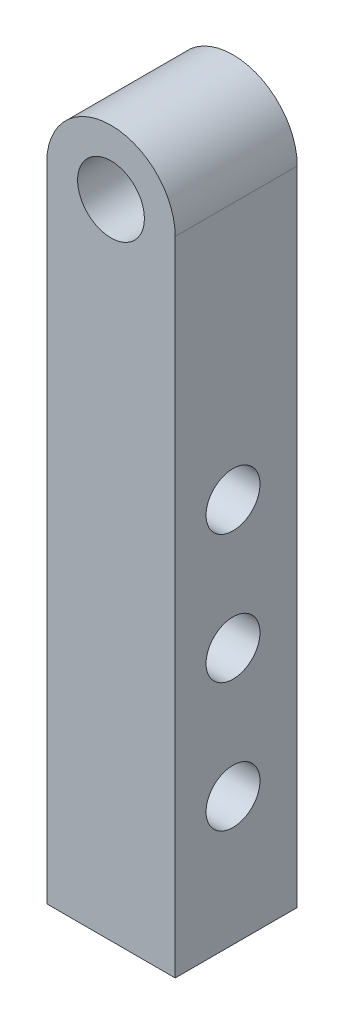
ISO-10303-21;
HEADER;
FILE_DESCRIPTION(('STEP AP214'),'2;1');
FILE_NAME('part.step','',(''),(''),'','','');
FILE_SCHEMA(('AUTOMOTIVE_DESIGN { 1 0 10303 214 1 1 1 1 }'));
ENDSEC;
DATA;
#1=APPLICATION_CONTEXT('core data for automotive mechanical design processes');
#2=APPLICATION_PROTOCOL_DEFINITION('international standard','automotive_design',2000,#1);
#3=PRODUCT_CONTEXT('',#1,'mechanical');
#4=PRODUCT('Part','Part','',(#3));
#5=PRODUCT_RELATED_PRODUCT_CATEGORY('part','',(#4));
#6=PRODUCT_DEFINITION_FORMATION('','',#4);
#7=PRODUCT_DEFINITION_CONTEXT('part definition',#1,'design');
#8=PRODUCT_DEFINITION('design','',#6,#7);
#9=PRODUCT_DEFINITION_SHAPE('','',#8);
#10=(LENGTH_UNIT() NAMED_UNIT(*) SI_UNIT(.MILLI.,.METRE.));
#11=(NAMED_UNIT(*) PLANE_ANGLE_UNIT() SI_UNIT($,.RADIAN.));
#12=(NAMED_UNIT(*) SI_UNIT($,.STERADIAN.) SOLID_ANGLE_UNIT());
#13=UNCERTAINTY_MEASURE_WITH_UNIT(LENGTH_MEASURE(1.E-05),#10,'distance_accuracy_value','');
#14=(GEOMETRIC_REPRESENTATION_CONTEXT(3) GLOBAL_UNCERTAINTY_ASSIGNED_CONTEXT((#13)) GLOBAL_UNIT_ASSIGNED_CONTEXT((#10,
#11,#12)) REPRESENTATION_CONTEXT('',''));
#15=CARTESIAN_POINT('',(0.,0.,0.));
#16=DIRECTION('',(0.,0.,1.));
#17=DIRECTION('',(1.,0.,0.));
#18=AXIS2_PLACEMENT_3D('',#15,#16,#17);
#19=CARTESIAN_POINT('',(0.,0.,9.5));
#20=DIRECTION('',(0.,0.,1.));
#21=DIRECTION('',(1.,0.,0.));
#22=AXIS2_PLACEMENT_3D('',#19,#20,#21);
#23=PLANE('',#22);
#24=CARTESIAN_POINT('',(0.,0.,9.5));
#25=DIRECTION('',(0.,0.,1.));
#26=DIRECTION('',(1.,0.,0.));
#27=AXIS2_PLACEMENT_3D('',#24,#25,#26);
#28=CIRCLE('',#27,5.);
#29=CARTESIAN_POINT('',(5.,0.,9.5));
#30=VERTEX_POINT('',#29);
#31=CARTESIAN_POINT('',(-5.,0.,9.5));
#32=VERTEX_POINT('',#31);
#33=EDGE_CURVE('E86',#30,#32,#28,.T.);
#34=ORIENTED_EDGE('',*,*,#33,.T.);
#35=DIRECTION('',(0.,-1.,0.));
#36=VECTOR('',#35,1.);
#37=CARTESIAN_POINT('',(-5.,0.,9.5));
#38=LINE('',#37,#36);
#39=CARTESIAN_POINT('',(-4.99999999999999,-50.,9.5));
#40=VERTEX_POINT('',#39);
#41=EDGE_CURVE('E81',#32,#40,#38,.T.);
#42=ORIENTED_EDGE('',*,*,#41,.T.);
#43=DIRECTION('',(1.,0.,0.));
#44=VECTOR('',#43,1.);
#45=CARTESIAN_POINT('',(-4.99999999999999,-50.,9.5));
#46=LINE('',#45,#44);
#47=CARTESIAN_POINT('',(4.99999999999999,-50.,9.5));
#48=VERTEX_POINT('',#47);
#49=EDGE_CURVE('E84',#40,#48,#46,.T.);
#50=ORIENTED_EDGE('',*,*,#49,.T.);
#51=DIRECTION('',(0.,1.,0.));
#52=VECTOR('',#51,1.);
#53=CARTESIAN_POINT('',(4.99999999999999,-50.,9.5));
#54=LINE('',#53,#52);
#55=EDGE_CURVE('E51',#48,#30,#54,.T.);
#56=ORIENTED_EDGE('',*,*,#55,.T.);
#57=EDGE_LOOP('',(#34,#42,#50,#56));
#58=FACE_BOUND('',#57,.T.);
#59=CARTESIAN_POINT('',(0.,0.,9.5));
#60=DIRECTION('',(0.,0.,1.));
#61=DIRECTION('',(1.,0.,0.));
#62=AXIS2_PLACEMENT_3D('',#59,#60,#61);
#63=CIRCLE('',#62,2.6);
#64=CARTESIAN_POINT('',(2.6,0.,9.5));
#65=VERTEX_POINT('',#64);
#66=EDGE_CURVE('E101',#65,#65,#63,.T.);
#67=ORIENTED_EDGE('',*,*,#66,.F.);
#68=EDGE_LOOP('',(#67));
#69=FACE_BOUND('',#68,.T.);
#70=ADVANCED_FACE('F34',(#58,#69),#23,.T.);
#71=CARTESIAN_POINT('',(0.,0.,0.));
#72=DIRECTION('',(0.,0.,1.));
#73=DIRECTION('',(1.,0.,0.));
#74=AXIS2_PLACEMENT_3D('',#71,#72,#73);
#75=PLANE('',#74);
#76=CARTESIAN_POINT('',(0.,0.,0.));
#77=DIRECTION('',(0.,0.,1.));
#78=DIRECTION('',(1.,0.,0.));
#79=AXIS2_PLACEMENT_3D('',#76,#77,#78);
#80=CIRCLE('',#79,5.);
#81=CARTESIAN_POINT('',(5.,0.,0.));
#82=VERTEX_POINT('',#81);
#83=CARTESIAN_POINT('',(-5.,0.,0.));
#84=VERTEX_POINT('',#83);
#85=EDGE_CURVE('E98',#82,#84,#80,.T.);
#86=ORIENTED_EDGE('',*,*,#85,.F.);
#87=DIRECTION('',(0.,1.,0.));
#88=VECTOR('',#87,1.);
#89=CARTESIAN_POINT('',(4.99999999999999,-50.,0.));
#90=LINE('',#89,#88);
#91=CARTESIAN_POINT('',(4.99999999999999,-50.,0.));
#92=VERTEX_POINT('',#91);
#93=EDGE_CURVE('E74',#92,#82,#90,.T.);
#94=ORIENTED_EDGE('',*,*,#93,.F.);
#95=DIRECTION('',(1.,0.,0.));
#96=VECTOR('',#95,1.);
#97=CARTESIAN_POINT('',(-4.99999999999999,-50.,0.));
#98=LINE('',#97,#96);
#99=CARTESIAN_POINT('',(-4.99999999999999,-50.,0.));
#100=VERTEX_POINT('',#99);
#101=EDGE_CURVE('E68',#100,#92,#98,.T.);
#102=ORIENTED_EDGE('',*,*,#101,.F.);
#103=DIRECTION('',(0.,-1.,0.));
#104=VECTOR('',#103,1.);
#105=CARTESIAN_POINT('',(-5.,0.,0.));
#106=LINE('',#105,#104);
#107=EDGE_CURVE('E90',#84,#100,#106,.T.);
#108=ORIENTED_EDGE('',*,*,#107,.F.);
#109=EDGE_LOOP('',(#86,#94,#102,#108));
#110=FACE_BOUND('',#109,.T.);
#111=CARTESIAN_POINT('',(0.,0.,0.));
#112=DIRECTION('',(0.,0.,1.));
#113=DIRECTION('',(1.,0.,0.));
#114=AXIS2_PLACEMENT_3D('',#111,#112,#113);
#115=CIRCLE('',#114,2.6);
#116=CARTESIAN_POINT('',(2.6,0.,0.));
#117=VERTEX_POINT('',#116);
#118=EDGE_CURVE('E113',#117,#117,#115,.T.);
#119=ORIENTED_EDGE('',*,*,#118,.T.);
#120=EDGE_LOOP('',(#119));
#121=FACE_BOUND('',#120,.T.);
#122=ADVANCED_FACE('F109',(#110,#121),#75,.F.);
#123=CARTESIAN_POINT('',(0.,0.,9.5));
#124=DIRECTION('',(0.,0.,-1.));
#125=DIRECTION('',(-1.,0.,0.));
#126=AXIS2_PLACEMENT_3D('',#123,#124,#125);
#127=CYLINDRICAL_SURFACE('',#126,5.);
#128=ORIENTED_EDGE('',*,*,#85,.T.);
#129=DIRECTION('',(0.,0.,-1.));
#130=VECTOR('',#129,1.);
#131=CARTESIAN_POINT('',(-5.,0.,9.5));
#132=LINE('',#131,#130);
#133=EDGE_CURVE('E11',#32,#84,#132,.T.);
#134=ORIENTED_EDGE('',*,*,#133,.F.);
#135=ORIENTED_EDGE('',*,*,#33,.F.);
#136=DIRECTION('',(0.,0.,-1.));
#137=VECTOR('',#136,1.);
#138=CARTESIAN_POINT('',(5.,0.,9.5));
#139=LINE('',#138,#137);
#140=EDGE_CURVE('E94',#30,#82,#139,.T.);
#141=ORIENTED_EDGE('',*,*,#140,.T.);
#142=EDGE_LOOP('',(#128,#134,#135,#141));
#143=FACE_BOUND('',#142,.T.);
#144=ADVANCED_FACE('F36',(#143),#127,.T.);
#145=CARTESIAN_POINT('',(-5.,0.,9.5));
#146=DIRECTION('',(1.,0.,0.));
#147=DIRECTION('',(0.,1.,0.));
#148=AXIS2_PLACEMENT_3D('',#145,#146,#147);
#149=PLANE('',#148);
#150=CARTESIAN_POINT('',(-5.,-30.,5.));
#151=DIRECTION('',(-1.,0.,0.));
#152=DIRECTION('',(0.,-1.,0.));
#153=AXIS2_PLACEMENT_3D('',#150,#151,#152);
#154=CIRCLE('',#153,2.1);
#155=CARTESIAN_POINT('',(-5.,-32.1,5.));
#156=VERTEX_POINT('',#155);
#157=EDGE_CURVE('E131',#156,#156,#154,.T.);
#158=ORIENTED_EDGE('',*,*,#157,.F.);
#159=EDGE_LOOP('',(#158));
#160=FACE_BOUND('',#159,.T.);
#161=CARTESIAN_POINT('',(-4.99999999999999,-40.,5.));
#162=DIRECTION('',(-1.,0.,0.));
#163=DIRECTION('',(0.,-1.,0.));
#164=AXIS2_PLACEMENT_3D('',#161,#162,#163);
#165=CIRCLE('',#164,2.1);
#166=CARTESIAN_POINT('',(-4.99999999999999,-42.1,5.));
#167=VERTEX_POINT('',#166);
#168=EDGE_CURVE('E125',#167,#167,#165,.T.);
#169=ORIENTED_EDGE('',*,*,#168,.F.);
#170=EDGE_LOOP('',(#169));
#171=FACE_BOUND('',#170,.T.);
#172=CARTESIAN_POINT('',(-5.,-20.,5.));
#173=DIRECTION('',(-1.,0.,0.));
#174=DIRECTION('',(0.,-1.,0.));
#175=AXIS2_PLACEMENT_3D('',#172,#173,#174);
#176=CIRCLE('',#175,2.1);
#177=CARTESIAN_POINT('',(-5.,-22.1,5.));
#178=VERTEX_POINT('',#177);
#179=EDGE_CURVE('E119',#178,#178,#176,.T.);
#180=ORIENTED_EDGE('',*,*,#179,.F.);
#181=EDGE_LOOP('',(#180));
#182=FACE_BOUND('',#181,.T.);
#183=ORIENTED_EDGE('',*,*,#107,.T.);
#184=DIRECTION('',(0.,0.,-1.));
#185=VECTOR('',#184,1.);
#186=CARTESIAN_POINT('',(-4.99999999999999,-50.,9.5));
#187=LINE('',#186,#185);
#188=EDGE_CURVE('E43',#40,#100,#187,.T.);
#189=ORIENTED_EDGE('',*,*,#188,.F.);
#190=ORIENTED_EDGE('',*,*,#41,.F.);
#191=ORIENTED_EDGE('',*,*,#133,.T.);
#192=EDGE_LOOP('',(#183,#189,#190,#191));
#193=FACE_BOUND('',#192,.T.);
#194=ADVANCED_FACE('F89',(#160,#171,#182,#193),#149,.F.);
#195=CARTESIAN_POINT('',(-4.99999999999999,-50.,9.5));
#196=DIRECTION('',(0.,1.,0.));
#197=DIRECTION('',(0.,0.,1.));
#198=AXIS2_PLACEMENT_3D('',#195,#196,#197);
#199=PLANE('',#198);
#200=ORIENTED_EDGE('',*,*,#101,.T.);
#201=DIRECTION('',(0.,0.,-1.));
#202=VECTOR('',#201,1.);
#203=CARTESIAN_POINT('',(4.99999999999999,-50.,9.5));
#204=LINE('',#203,#202);
#205=EDGE_CURVE('E91',#48,#92,#204,.T.);
#206=ORIENTED_EDGE('',*,*,#205,.F.);
#207=ORIENTED_EDGE('',*,*,#49,.F.);
#208=ORIENTED_EDGE('',*,*,#188,.T.);
#209=EDGE_LOOP('',(#200,#206,#207,#208));
#210=FACE_BOUND('',#209,.T.);
#211=ADVANCED_FACE('F92',(#210),#199,.F.);
#212=CARTESIAN_POINT('',(4.99999999999999,-50.,9.5));
#213=DIRECTION('',(-1.,0.,0.));
#214=DIRECTION('',(0.,-1.,0.));
#215=AXIS2_PLACEMENT_3D('',#212,#213,#214);
#216=PLANE('',#215);
#217=CARTESIAN_POINT('',(5.,-30.,5.));
#218=DIRECTION('',(-1.,0.,0.));
#219=DIRECTION('',(0.,-1.,0.));
#220=AXIS2_PLACEMENT_3D('',#217,#218,#219);
#221=CIRCLE('',#220,2.1);
#222=CARTESIAN_POINT('',(5.,-32.1,5.));
#223=VERTEX_POINT('',#222);
#224=EDGE_CURVE('E122',#223,#223,#221,.T.);
#225=ORIENTED_EDGE('',*,*,#224,.T.);
#226=EDGE_LOOP('',(#225));
#227=FACE_BOUND('',#226,.T.);
#228=CARTESIAN_POINT('',(5.00000000000001,-40.,5.));
#229=DIRECTION('',(-1.,0.,0.));
#230=DIRECTION('',(0.,-1.,0.));
#231=AXIS2_PLACEMENT_3D('',#228,#229,#230);
#232=CIRCLE('',#231,2.1);
#233=CARTESIAN_POINT('',(5.00000000000001,-42.1,5.));
#234=VERTEX_POINT('',#233);
#235=EDGE_CURVE('E128',#234,#234,#232,.T.);
#236=ORIENTED_EDGE('',*,*,#235,.T.);
#237=EDGE_LOOP('',(#236));
#238=FACE_BOUND('',#237,.T.);
#239=CARTESIAN_POINT('',(5.,-20.,5.));
#240=DIRECTION('',(-1.,0.,0.));
#241=DIRECTION('',(0.,-1.,0.));
#242=AXIS2_PLACEMENT_3D('',#239,#240,#241);
#243=CIRCLE('',#242,2.1);
#244=CARTESIAN_POINT('',(5.,-22.1,5.));
#245=VERTEX_POINT('',#244);
#246=EDGE_CURVE('E116',#245,#245,#243,.T.);
#247=ORIENTED_EDGE('',*,*,#246,.T.);
#248=EDGE_LOOP('',(#247));
#249=FACE_BOUND('',#248,.T.);
#250=ORIENTED_EDGE('',*,*,#93,.T.);
#251=ORIENTED_EDGE('',*,*,#140,.F.);
#252=ORIENTED_EDGE('',*,*,#55,.F.);
#253=ORIENTED_EDGE('',*,*,#205,.T.);
#254=EDGE_LOOP('',(#250,#251,#252,#253));
#255=FACE_BOUND('',#254,.T.);
#256=ADVANCED_FACE('F106',(#227,#238,#249,#255),#216,.F.);
#257=CARTESIAN_POINT('',(0.,0.,9.5));
#258=DIRECTION('',(0.,0.,-1.));
#259=DIRECTION('',(-1.,0.,0.));
#260=AXIS2_PLACEMENT_3D('',#257,#258,#259);
#261=CYLINDRICAL_SURFACE('',#260,2.6);
#262=ORIENTED_EDGE('',*,*,#66,.T.);
#263=EDGE_LOOP('',(#262));
#264=FACE_BOUND('',#263,.T.);
#265=ORIENTED_EDGE('',*,*,#118,.F.);
#266=EDGE_LOOP('',(#265));
#267=FACE_BOUND('',#266,.T.);
#268=ADVANCED_FACE('F154',(#264,#267),#261,.F.);
#269=CARTESIAN_POINT('',(5.,-20.,5.));
#270=DIRECTION('',(-1.,0.,0.));
#271=DIRECTION('',(0.,-1.,0.));
#272=AXIS2_PLACEMENT_3D('',#269,#270,#271);
#273=CYLINDRICAL_SURFACE('',#272,2.1);
#274=ORIENTED_EDGE('',*,*,#246,.F.);
#275=EDGE_LOOP('',(#274));
#276=FACE_BOUND('',#275,.T.);
#277=ORIENTED_EDGE('',*,*,#179,.T.);
#278=EDGE_LOOP('',(#277));
#279=FACE_BOUND('',#278,.T.);
#280=ADVANCED_FACE('F152',(#276,#279),#273,.F.);
#281=CARTESIAN_POINT('',(5.00000000000001,-40.,5.));
#282=DIRECTION('',(-1.,0.,0.));
#283=DIRECTION('',(0.,-1.,0.));
#284=AXIS2_PLACEMENT_3D('',#281,#282,#283);
#285=CYLINDRICAL_SURFACE('',#284,2.1);
#286=ORIENTED_EDGE('',*,*,#235,.F.);
#287=EDGE_LOOP('',(#286));
#288=FACE_BOUND('',#287,.T.);
#289=ORIENTED_EDGE('',*,*,#168,.T.);
#290=EDGE_LOOP('',(#289));
#291=FACE_BOUND('',#290,.T.);
#292=ADVANCED_FACE('F142',(#288,#291),#285,.F.);
#293=CARTESIAN_POINT('',(5.,-30.,5.));
#294=DIRECTION('',(-1.,0.,0.));
#295=DIRECTION('',(0.,-1.,0.));
#296=AXIS2_PLACEMENT_3D('',#293,#294,#295);
#297=CYLINDRICAL_SURFACE('',#296,2.1);
#298=ORIENTED_EDGE('',*,*,#224,.F.);
#299=EDGE_LOOP('',(#298));
#300=FACE_BOUND('',#299,.T.);
#301=ORIENTED_EDGE('',*,*,#157,.T.);
#302=EDGE_LOOP('',(#301));
#303=FACE_BOUND('',#302,.T.);
#304=ADVANCED_FACE('F139',(#300,#303),#297,.F.);
#305=CLOSED_SHELL('',(#70,#122,#144,#194,#211,#256,#268,#280,#292,#304));
#306=MANIFOLD_SOLID_BREP('B2',#305);
#307=ADVANCED_BREP_SHAPE_REPRESENTATION('',(#18,#306),#14);
#308=SHAPE_DEFINITION_REPRESENTATION(#9,#307);
ENDSEC;
END-ISO-10303-21;
